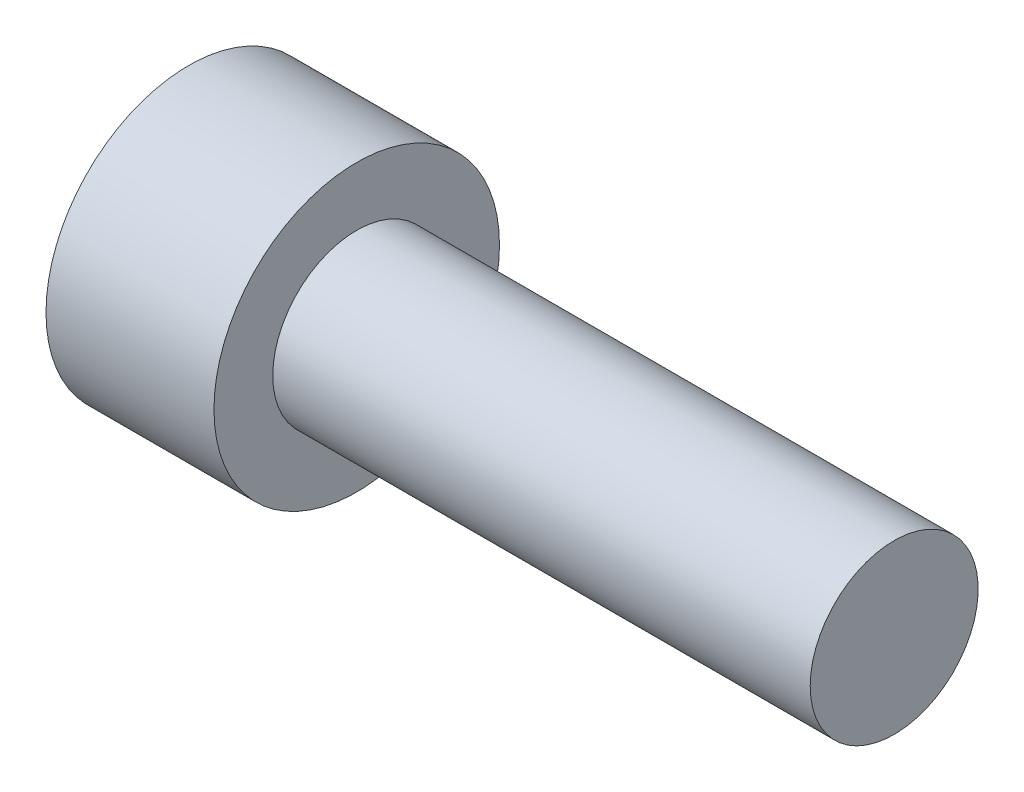
ISO-10303-21;
HEADER;
FILE_DESCRIPTION(('STEP AP214'),'2;1');
FILE_NAME('part.step','',(''),(''),'','','');
FILE_SCHEMA(('AUTOMOTIVE_DESIGN { 1 0 10303 214 1 1 1 1 }'));
ENDSEC;
DATA;
#1=APPLICATION_CONTEXT('core data for automotive mechanical design processes');
#2=APPLICATION_PROTOCOL_DEFINITION('international standard','automotive_design',2000,#1);
#3=PRODUCT_CONTEXT('',#1,'mechanical');
#4=PRODUCT('Part','Part','',(#3));
#5=PRODUCT_RELATED_PRODUCT_CATEGORY('part','',(#4));
#6=PRODUCT_DEFINITION_FORMATION('','',#4);
#7=PRODUCT_DEFINITION_CONTEXT('part definition',#1,'design');
#8=PRODUCT_DEFINITION('design','',#6,#7);
#9=PRODUCT_DEFINITION_SHAPE('','',#8);
#10=(LENGTH_UNIT() NAMED_UNIT(*) SI_UNIT(.MILLI.,.METRE.));
#11=(NAMED_UNIT(*) PLANE_ANGLE_UNIT() SI_UNIT($,.RADIAN.));
#12=(NAMED_UNIT(*) SI_UNIT($,.STERADIAN.) SOLID_ANGLE_UNIT());
#13=UNCERTAINTY_MEASURE_WITH_UNIT(LENGTH_MEASURE(1.E-05),#10,'distance_accuracy_value','');
#14=(GEOMETRIC_REPRESENTATION_CONTEXT(3) GLOBAL_UNCERTAINTY_ASSIGNED_CONTEXT((#13)) GLOBAL_UNIT_ASSIGNED_CONTEXT((#10,
#11,#12)) REPRESENTATION_CONTEXT('',''));
#15=CARTESIAN_POINT('',(0.,0.,0.));
#16=DIRECTION('',(0.,0.,1.));
#17=DIRECTION('',(1.,0.,0.));
#18=AXIS2_PLACEMENT_3D('',#15,#16,#17);
#19=CARTESIAN_POINT('',(0.,0.,0.));
#20=DIRECTION('',(1.,0.,0.));
#21=DIRECTION('',(0.,0.,-1.));
#22=AXIS2_PLACEMENT_3D('',#19,#20,#21);
#23=PLANE('',#22);
#24=CARTESIAN_POINT('',(0.,0.,0.));
#25=DIRECTION('',(-1.,0.,0.));
#26=DIRECTION('',(0.,0.,1.));
#27=AXIS2_PLACEMENT_3D('',#24,#25,#26);
#28=CIRCLE('',#27,4.25);
#29=CARTESIAN_POINT('',(0.,0.,4.25));
#30=VERTEX_POINT('',#29);
#31=EDGE_CURVE('E11',#30,#30,#28,.T.);
#32=ORIENTED_EDGE('',*,*,#31,.T.);
#33=EDGE_LOOP('',(#32));
#34=FACE_BOUND('',#33,.T.);
#35=DIRECTION('',(0.,0.5,0.866025403784439));
#36=VECTOR('',#35,1.);
#37=CARTESIAN_POINT('',(0.,-2.3094010767585,0.));
#38=LINE('',#37,#36);
#39=CARTESIAN_POINT('',(0.,-2.3094010767585,0.));
#40=VERTEX_POINT('',#39);
#41=CARTESIAN_POINT('',(0.,-1.15470053837925,2.));
#42=VERTEX_POINT('',#41);
#43=EDGE_CURVE('E149',#40,#42,#38,.T.);
#44=ORIENTED_EDGE('',*,*,#43,.F.);
#45=DIRECTION('',(0.,-0.5,0.866025403784439));
#46=VECTOR('',#45,1.);
#47=CARTESIAN_POINT('',(0.,-1.15470053837925,-2.));
#48=LINE('',#47,#46);
#49=CARTESIAN_POINT('',(0.,-1.15470053837925,-2.));
#50=VERTEX_POINT('',#49);
#51=EDGE_CURVE('E49',#50,#40,#48,.T.);
#52=ORIENTED_EDGE('',*,*,#51,.F.);
#53=DIRECTION('',(0.,-1.,0.));
#54=VECTOR('',#53,1.);
#55=CARTESIAN_POINT('',(0.,1.15470053837925,-2.));
#56=LINE('',#55,#54);
#57=CARTESIAN_POINT('',(0.,1.15470053837925,-2.));
#58=VERTEX_POINT('',#57);
#59=EDGE_CURVE('E119',#58,#50,#56,.T.);
#60=ORIENTED_EDGE('',*,*,#59,.F.);
#61=DIRECTION('',(0.,-0.5,-0.866025403784439));
#62=VECTOR('',#61,1.);
#63=CARTESIAN_POINT('',(0.,2.3094010767585,0.));
#64=LINE('',#63,#62);
#65=CARTESIAN_POINT('',(0.,2.3094010767585,0.));
#66=VERTEX_POINT('',#65);
#67=EDGE_CURVE('E155',#66,#58,#64,.T.);
#68=ORIENTED_EDGE('',*,*,#67,.F.);
#69=DIRECTION('',(0.,0.5,-0.866025403784439));
#70=VECTOR('',#69,1.);
#71=CARTESIAN_POINT('',(0.,1.15470053837925,2.));
#72=LINE('',#71,#70);
#73=CARTESIAN_POINT('',(0.,1.15470053837925,2.));
#74=VERTEX_POINT('',#73);
#75=EDGE_CURVE('E153',#74,#66,#72,.T.);
#76=ORIENTED_EDGE('',*,*,#75,.F.);
#77=DIRECTION('',(0.,1.,0.));
#78=VECTOR('',#77,1.);
#79=CARTESIAN_POINT('',(0.,-1.15470053837925,2.));
#80=LINE('',#79,#78);
#81=EDGE_CURVE('E151',#42,#74,#80,.T.);
#82=ORIENTED_EDGE('',*,*,#81,.F.);
#83=EDGE_LOOP('',(#44,#52,#60,#68,#76,#82));
#84=FACE_BOUND('',#83,.T.);
#85=ADVANCED_FACE('F35',(#34,#84),#23,.F.);
#86=CARTESIAN_POINT('',(0.,0.,0.));
#87=DIRECTION('',(-1.,0.,0.));
#88=DIRECTION('',(0.,0.,1.));
#89=AXIS2_PLACEMENT_3D('',#86,#87,#88);
#90=CYLINDRICAL_SURFACE('',#89,4.25);
#91=ORIENTED_EDGE('',*,*,#31,.F.);
#92=EDGE_LOOP('',(#91));
#93=FACE_BOUND('',#92,.T.);
#94=CARTESIAN_POINT('',(5.,0.,0.));
#95=DIRECTION('',(-1.,0.,0.));
#96=DIRECTION('',(0.,0.,1.));
#97=AXIS2_PLACEMENT_3D('',#94,#95,#96);
#98=CIRCLE('',#97,4.25);
#99=CARTESIAN_POINT('',(5.,0.,4.25));
#100=VERTEX_POINT('',#99);
#101=EDGE_CURVE('E42',#100,#100,#98,.T.);
#102=ORIENTED_EDGE('',*,*,#101,.T.);
#103=EDGE_LOOP('',(#102));
#104=FACE_BOUND('',#103,.T.);
#105=ADVANCED_FACE('F183',(#93,#104),#90,.T.);
#106=CARTESIAN_POINT('',(5.,2.5,0.));
#107=DIRECTION('',(-1.,0.,0.));
#108=DIRECTION('',(0.,0.,1.));
#109=AXIS2_PLACEMENT_3D('',#106,#107,#108);
#110=PLANE('',#109);
#111=ORIENTED_EDGE('',*,*,#101,.F.);
#112=EDGE_LOOP('',(#111));
#113=FACE_BOUND('',#112,.T.);
#114=CARTESIAN_POINT('',(5.,0.,0.));
#115=DIRECTION('',(-1.,0.,0.));
#116=DIRECTION('',(0.,0.,1.));
#117=AXIS2_PLACEMENT_3D('',#114,#115,#116);
#118=CIRCLE('',#117,2.5);
#119=CARTESIAN_POINT('',(5.,0.,2.5));
#120=VERTEX_POINT('',#119);
#121=EDGE_CURVE('E178',#120,#120,#118,.T.);
#122=ORIENTED_EDGE('',*,*,#121,.T.);
#123=EDGE_LOOP('',(#122));
#124=FACE_BOUND('',#123,.T.);
#125=ADVANCED_FACE('F185',(#113,#124),#110,.F.);
#126=CARTESIAN_POINT('',(0.,0.,0.));
#127=DIRECTION('',(-1.,0.,0.));
#128=DIRECTION('',(0.,0.,1.));
#129=AXIS2_PLACEMENT_3D('',#126,#127,#128);
#130=CYLINDRICAL_SURFACE('',#129,2.5);
#131=ORIENTED_EDGE('',*,*,#121,.F.);
#132=EDGE_LOOP('',(#131));
#133=FACE_BOUND('',#132,.T.);
#134=CARTESIAN_POINT('',(21.,0.,0.));
#135=DIRECTION('',(-1.,0.,0.));
#136=DIRECTION('',(0.,0.,1.));
#137=AXIS2_PLACEMENT_3D('',#134,#135,#136);
#138=CIRCLE('',#137,2.5);
#139=CARTESIAN_POINT('',(21.,0.,2.5));
#140=VERTEX_POINT('',#139);
#141=EDGE_CURVE('E174',#140,#140,#138,.T.);
#142=ORIENTED_EDGE('',*,*,#141,.T.);
#143=EDGE_LOOP('',(#142));
#144=FACE_BOUND('',#143,.T.);
#145=ADVANCED_FACE('F188',(#133,#144),#130,.T.);
#146=CARTESIAN_POINT('',(21.,2.5,0.));
#147=DIRECTION('',(-1.,0.,0.));
#148=DIRECTION('',(0.,0.,1.));
#149=AXIS2_PLACEMENT_3D('',#146,#147,#148);
#150=PLANE('',#149);
#151=ORIENTED_EDGE('',*,*,#141,.F.);
#152=EDGE_LOOP('',(#151));
#153=FACE_BOUND('',#152,.T.);
#154=ADVANCED_FACE('F194',(#153),#150,.F.);
#155=CARTESIAN_POINT('',(2.5,-1.15470053837925,-2.));
#156=DIRECTION('',(0.,-0.866025403784439,-0.5));
#157=DIRECTION('',(0.,0.5,-0.866025403784439));
#158=AXIS2_PLACEMENT_3D('',#155,#156,#157);
#159=PLANE('',#158);
#160=DIRECTION('',(0.,-0.5,0.866025403784439));
#161=VECTOR('',#160,1.);
#162=CARTESIAN_POINT('',(2.5,-1.15470053837925,-2.));
#163=LINE('',#162,#161);
#164=CARTESIAN_POINT('',(2.5,-1.15470053837925,-2.));
#165=VERTEX_POINT('',#164);
#166=CARTESIAN_POINT('',(2.5,-1.73205080756888,-0.999999999999999));
#167=VERTEX_POINT('',#166);
#168=EDGE_CURVE('E118',#165,#167,#163,.T.);
#169=ORIENTED_EDGE('',*,*,#168,.F.);
#170=DIRECTION('',(-1.,0.,0.));
#171=VECTOR('',#170,1.);
#172=CARTESIAN_POINT('',(2.5,-1.15470053837925,-2.));
#173=LINE('',#172,#171);
#174=EDGE_CURVE('E158',#165,#50,#173,.T.);
#175=ORIENTED_EDGE('',*,*,#174,.T.);
#176=ORIENTED_EDGE('',*,*,#51,.T.);
#177=DIRECTION('',(-1.,0.,0.));
#178=VECTOR('',#177,1.);
#179=CARTESIAN_POINT('',(2.5,-2.3094010767585,0.));
#180=LINE('',#179,#178);
#181=CARTESIAN_POINT('',(2.5,-2.3094010767585,0.));
#182=VERTEX_POINT('',#181);
#183=EDGE_CURVE('E121',#182,#40,#180,.T.);
#184=ORIENTED_EDGE('',*,*,#183,.F.);
#185=EDGE_CURVE('E110',#167,#182,#163,.T.);
#186=ORIENTED_EDGE('',*,*,#185,.F.);
#187=EDGE_LOOP('',(#169,#175,#176,#184,#186));
#188=FACE_BOUND('',#187,.T.);
#189=ADVANCED_FACE('F122',(#188),#159,.F.);
#190=CARTESIAN_POINT('',(2.5,1.15470053837925,-2.));
#191=DIRECTION('',(0.,0.,-1.));
#192=DIRECTION('',(-1.,0.,0.));
#193=AXIS2_PLACEMENT_3D('',#190,#191,#192);
#194=PLANE('',#193);
#195=DIRECTION('',(0.,-1.,0.));
#196=VECTOR('',#195,1.);
#197=CARTESIAN_POINT('',(2.5,1.15470053837925,-2.));
#198=LINE('',#197,#196);
#199=CARTESIAN_POINT('',(2.5,1.15470053837925,-2.));
#200=VERTEX_POINT('',#199);
#201=CARTESIAN_POINT('',(2.5,0.,-2.));
#202=VERTEX_POINT('',#201);
#203=EDGE_CURVE('E127',#200,#202,#198,.T.);
#204=ORIENTED_EDGE('',*,*,#203,.F.);
#205=DIRECTION('',(-1.,0.,0.));
#206=VECTOR('',#205,1.);
#207=CARTESIAN_POINT('',(2.5,1.15470053837925,-2.));
#208=LINE('',#207,#206);
#209=EDGE_CURVE('E160',#200,#58,#208,.T.);
#210=ORIENTED_EDGE('',*,*,#209,.T.);
#211=ORIENTED_EDGE('',*,*,#59,.T.);
#212=ORIENTED_EDGE('',*,*,#174,.F.);
#213=EDGE_CURVE('E145',#202,#165,#198,.T.);
#214=ORIENTED_EDGE('',*,*,#213,.F.);
#215=EDGE_LOOP('',(#204,#210,#211,#212,#214));
#216=FACE_BOUND('',#215,.T.);
#217=ADVANCED_FACE('F203',(#216),#194,.F.);
#218=CARTESIAN_POINT('',(2.5,2.3094010767585,0.));
#219=DIRECTION('',(0.,0.866025403784439,-0.5));
#220=DIRECTION('',(0.,0.5,0.866025403784439));
#221=AXIS2_PLACEMENT_3D('',#218,#219,#220);
#222=PLANE('',#221);
#223=DIRECTION('',(0.,-0.5,-0.866025403784439));
#224=VECTOR('',#223,1.);
#225=CARTESIAN_POINT('',(2.5,2.3094010767585,0.));
#226=LINE('',#225,#224);
#227=CARTESIAN_POINT('',(2.5,2.3094010767585,0.));
#228=VERTEX_POINT('',#227);
#229=CARTESIAN_POINT('',(2.5,1.73205080756888,-0.999999999999999));
#230=VERTEX_POINT('',#229);
#231=EDGE_CURVE('E142',#228,#230,#226,.T.);
#232=ORIENTED_EDGE('',*,*,#231,.F.);
#233=DIRECTION('',(-1.,0.,0.));
#234=VECTOR('',#233,1.);
#235=CARTESIAN_POINT('',(2.5,2.3094010767585,0.));
#236=LINE('',#235,#234);
#237=EDGE_CURVE('E163',#228,#66,#236,.T.);
#238=ORIENTED_EDGE('',*,*,#237,.T.);
#239=ORIENTED_EDGE('',*,*,#67,.T.);
#240=ORIENTED_EDGE('',*,*,#209,.F.);
#241=EDGE_CURVE('E141',#230,#200,#226,.T.);
#242=ORIENTED_EDGE('',*,*,#241,.F.);
#243=EDGE_LOOP('',(#232,#238,#239,#240,#242));
#244=FACE_BOUND('',#243,.T.);
#245=ADVANCED_FACE('F256',(#244),#222,.F.);
#246=CARTESIAN_POINT('',(2.5,1.15470053837925,2.));
#247=DIRECTION('',(0.,0.866025403784439,0.5));
#248=DIRECTION('',(0.,-0.5,0.866025403784439));
#249=AXIS2_PLACEMENT_3D('',#246,#247,#248);
#250=PLANE('',#249);
#251=DIRECTION('',(0.,0.5,-0.866025403784439));
#252=VECTOR('',#251,1.);
#253=CARTESIAN_POINT('',(2.5,1.15470053837925,2.));
#254=LINE('',#253,#252);
#255=CARTESIAN_POINT('',(2.5,1.15470053837925,2.));
#256=VERTEX_POINT('',#255);
#257=CARTESIAN_POINT('',(2.5,1.73205080756888,0.999999999999999));
#258=VERTEX_POINT('',#257);
#259=EDGE_CURVE('E138',#256,#258,#254,.T.);
#260=ORIENTED_EDGE('',*,*,#259,.F.);
#261=DIRECTION('',(-1.,0.,0.));
#262=VECTOR('',#261,1.);
#263=CARTESIAN_POINT('',(2.5,1.15470053837925,2.));
#264=LINE('',#263,#262);
#265=EDGE_CURVE('E166',#256,#74,#264,.T.);
#266=ORIENTED_EDGE('',*,*,#265,.T.);
#267=ORIENTED_EDGE('',*,*,#75,.T.);
#268=ORIENTED_EDGE('',*,*,#237,.F.);
#269=EDGE_CURVE('E137',#258,#228,#254,.T.);
#270=ORIENTED_EDGE('',*,*,#269,.F.);
#271=EDGE_LOOP('',(#260,#266,#267,#268,#270));
#272=FACE_BOUND('',#271,.T.);
#273=ADVANCED_FACE('F251',(#272),#250,.F.);
#274=CARTESIAN_POINT('',(2.5,-1.15470053837925,2.));
#275=DIRECTION('',(0.,0.,1.));
#276=DIRECTION('',(1.,0.,0.));
#277=AXIS2_PLACEMENT_3D('',#274,#275,#276);
#278=PLANE('',#277);
#279=DIRECTION('',(0.,1.,0.));
#280=VECTOR('',#279,1.);
#281=CARTESIAN_POINT('',(2.5,-1.15470053837925,2.));
#282=LINE('',#281,#280);
#283=CARTESIAN_POINT('',(2.5,-1.15470053837925,2.));
#284=VERTEX_POINT('',#283);
#285=CARTESIAN_POINT('',(2.5,0.,2.));
#286=VERTEX_POINT('',#285);
#287=EDGE_CURVE('E57',#284,#286,#282,.T.);
#288=ORIENTED_EDGE('',*,*,#287,.F.);
#289=DIRECTION('',(-1.,0.,0.));
#290=VECTOR('',#289,1.);
#291=CARTESIAN_POINT('',(2.5,-1.15470053837925,2.));
#292=LINE('',#291,#290);
#293=EDGE_CURVE('E126',#284,#42,#292,.T.);
#294=ORIENTED_EDGE('',*,*,#293,.T.);
#295=ORIENTED_EDGE('',*,*,#81,.T.);
#296=ORIENTED_EDGE('',*,*,#265,.F.);
#297=EDGE_CURVE('E133',#286,#256,#282,.T.);
#298=ORIENTED_EDGE('',*,*,#297,.F.);
#299=EDGE_LOOP('',(#288,#294,#295,#296,#298));
#300=FACE_BOUND('',#299,.T.);
#301=ADVANCED_FACE('F217',(#300),#278,.F.);
#302=CARTESIAN_POINT('',(2.5,-2.3094010767585,0.));
#303=DIRECTION('',(0.,-0.866025403784438,0.5));
#304=DIRECTION('',(0.,-0.5,-0.866025403784438));
#305=AXIS2_PLACEMENT_3D('',#302,#303,#304);
#306=PLANE('',#305);
#307=DIRECTION('',(0.,0.5,0.866025403784439));
#308=VECTOR('',#307,1.);
#309=CARTESIAN_POINT('',(2.5,-2.3094010767585,0.));
#310=LINE('',#309,#308);
#311=CARTESIAN_POINT('',(2.5,-1.73205080756888,1.));
#312=VERTEX_POINT('',#311);
#313=EDGE_CURVE('E113',#182,#312,#310,.T.);
#314=ORIENTED_EDGE('',*,*,#313,.F.);
#315=ORIENTED_EDGE('',*,*,#183,.T.);
#316=ORIENTED_EDGE('',*,*,#43,.T.);
#317=ORIENTED_EDGE('',*,*,#293,.F.);
#318=EDGE_CURVE('E132',#312,#284,#310,.T.);
#319=ORIENTED_EDGE('',*,*,#318,.F.);
#320=EDGE_LOOP('',(#314,#315,#316,#317,#319));
#321=FACE_BOUND('',#320,.T.);
#322=ADVANCED_FACE('F130',(#321),#306,.F.);
#323=CARTESIAN_POINT('',(2.5,0.,0.));
#324=DIRECTION('',(-1.,0.,0.));
#325=DIRECTION('',(0.,0.,1.));
#326=AXIS2_PLACEMENT_3D('',#323,#324,#325);
#327=PLANE('',#326);
#328=ORIENTED_EDGE('',*,*,#297,.T.);
#329=ORIENTED_EDGE('',*,*,#259,.T.);
#330=CARTESIAN_POINT('',(2.5,0.,0.));
#331=DIRECTION('',(-1.,0.,0.));
#332=DIRECTION('',(0.,-1.,0.));
#333=AXIS2_PLACEMENT_3D('',#330,#331,#332);
#334=CIRCLE('',#333,2.);
#335=EDGE_CURVE('E175',#286,#258,#334,.T.);
#336=ORIENTED_EDGE('',*,*,#335,.F.);
#337=EDGE_LOOP('',(#328,#329,#336));
#338=FACE_BOUND('',#337,.T.);
#339=ADVANCED_FACE('F223',(#338),#327,.T.);
#340=ORIENTED_EDGE('',*,*,#269,.T.);
#341=ORIENTED_EDGE('',*,*,#231,.T.);
#342=EDGE_CURVE('E226',#258,#230,#334,.T.);
#343=ORIENTED_EDGE('',*,*,#342,.F.);
#344=EDGE_LOOP('',(#340,#341,#343));
#345=FACE_BOUND('',#344,.T.);
#346=ADVANCED_FACE('F240',(#345),#327,.T.);
#347=ORIENTED_EDGE('',*,*,#241,.T.);
#348=ORIENTED_EDGE('',*,*,#203,.T.);
#349=EDGE_CURVE('E270',#230,#202,#334,.T.);
#350=ORIENTED_EDGE('',*,*,#349,.F.);
#351=EDGE_LOOP('',(#347,#348,#350));
#352=FACE_BOUND('',#351,.T.);
#353=ADVANCED_FACE('F245',(#352),#327,.T.);
#354=ORIENTED_EDGE('',*,*,#213,.T.);
#355=ORIENTED_EDGE('',*,*,#168,.T.);
#356=EDGE_CURVE('E272',#202,#167,#334,.T.);
#357=ORIENTED_EDGE('',*,*,#356,.F.);
#358=EDGE_LOOP('',(#354,#355,#357));
#359=FACE_BOUND('',#358,.T.);
#360=ADVANCED_FACE('F237',(#359),#327,.T.);
#361=ORIENTED_EDGE('',*,*,#185,.T.);
#362=ORIENTED_EDGE('',*,*,#313,.T.);
#363=EDGE_CURVE('E115',#167,#312,#334,.T.);
#364=ORIENTED_EDGE('',*,*,#363,.F.);
#365=EDGE_LOOP('',(#361,#362,#364));
#366=FACE_BOUND('',#365,.T.);
#367=ADVANCED_FACE('F111',(#366),#327,.T.);
#368=ORIENTED_EDGE('',*,*,#318,.T.);
#369=ORIENTED_EDGE('',*,*,#287,.T.);
#370=EDGE_CURVE('E171',#312,#286,#334,.T.);
#371=ORIENTED_EDGE('',*,*,#370,.F.);
#372=EDGE_LOOP('',(#368,#369,#371));
#373=FACE_BOUND('',#372,.T.);
#374=ADVANCED_FACE('F230',(#373),#327,.T.);
#375=CARTESIAN_POINT('',(3.65470053837925,0.,0.));
#376=DIRECTION('',(-1.,0.,0.));
#377=DIRECTION('',(0.,-1.,0.));
#378=AXIS2_PLACEMENT_3D('',#375,#376,#377);
#379=CONICAL_SURFACE('',#378,0.,1.0471975511966);
#380=ORIENTED_EDGE('',*,*,#370,.T.);
#381=ORIENTED_EDGE('',*,*,#335,.T.);
#382=ORIENTED_EDGE('',*,*,#342,.T.);
#383=ORIENTED_EDGE('',*,*,#349,.T.);
#384=ORIENTED_EDGE('',*,*,#356,.T.);
#385=ORIENTED_EDGE('',*,*,#363,.T.);
#386=EDGE_LOOP('',(#380,#381,#382,#383,#384,#385));
#387=FACE_BOUND('',#386,.T.);
#388=CARTESIAN_POINT('',(3.65470053837925,0.,0.));
#389=VERTEX_POINT('',#388);
#390=VERTEX_LOOP('',#389);
#391=FACE_BOUND('',#390,.T.);
#392=ADVANCED_FACE('F227',(#387,#391),#379,.F.);
#393=CLOSED_SHELL('',(#85,#105,#125,#145,#154,#189,#217,#245,#273,#301,#322,#339,#346,#353,#360,
#367,#374,#392));
#394=MANIFOLD_SOLID_BREP('B2',#393);
#395=ADVANCED_BREP_SHAPE_REPRESENTATION('',(#18,#394),#14);
#396=SHAPE_DEFINITION_REPRESENTATION(#9,#395);
ENDSEC;
END-ISO-10303-21;
